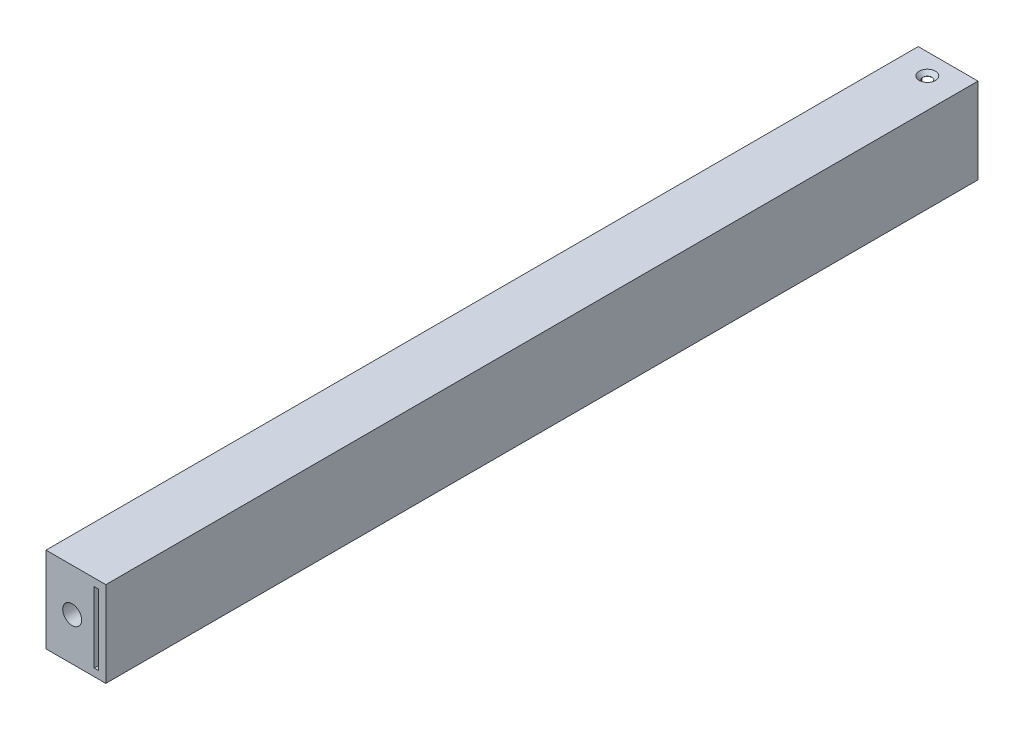
ISO-10303-21;
HEADER;
FILE_DESCRIPTION(('STEP AP214'),'2;1');
FILE_NAME('part.step','',(''),(''),'','','');
FILE_SCHEMA(('AUTOMOTIVE_DESIGN { 1 0 10303 214 1 1 1 1 }'));
ENDSEC;
DATA;
#1=APPLICATION_CONTEXT('core data for automotive mechanical design processes');
#2=APPLICATION_PROTOCOL_DEFINITION('international standard','automotive_design',2000,#1);
#3=PRODUCT_CONTEXT('',#1,'mechanical');
#4=PRODUCT('Part','Part','',(#3));
#5=PRODUCT_RELATED_PRODUCT_CATEGORY('part','',(#4));
#6=PRODUCT_DEFINITION_FORMATION('','',#4);
#7=PRODUCT_DEFINITION_CONTEXT('part definition',#1,'design');
#8=PRODUCT_DEFINITION('design','',#6,#7);
#9=PRODUCT_DEFINITION_SHAPE('','',#8);
#10=(LENGTH_UNIT() NAMED_UNIT(*) SI_UNIT(.MILLI.,.METRE.));
#11=(NAMED_UNIT(*) PLANE_ANGLE_UNIT() SI_UNIT($,.RADIAN.));
#12=(NAMED_UNIT(*) SI_UNIT($,.STERADIAN.) SOLID_ANGLE_UNIT());
#13=UNCERTAINTY_MEASURE_WITH_UNIT(LENGTH_MEASURE(1.E-05),#10,'distance_accuracy_value','');
#14=(GEOMETRIC_REPRESENTATION_CONTEXT(3) GLOBAL_UNCERTAINTY_ASSIGNED_CONTEXT((#13)) GLOBAL_UNIT_ASSIGNED_CONTEXT((#10,
#11,#12)) REPRESENTATION_CONTEXT('',''));
#15=CARTESIAN_POINT('',(0.,0.,0.));
#16=DIRECTION('',(0.,0.,1.));
#17=DIRECTION('',(1.,0.,0.));
#18=AXIS2_PLACEMENT_3D('',#15,#16,#17);
#19=CARTESIAN_POINT('',(0.,0.,-3.2));
#20=DIRECTION('',(0.,0.,1.));
#21=DIRECTION('',(1.,0.,0.));
#22=AXIS2_PLACEMENT_3D('',#19,#20,#21);
#23=PLANE('',#22);
#24=CARTESIAN_POINT('',(0.,0.,-3.20000000000001));
#25=DIRECTION('',(0.,0.,1.));
#26=DIRECTION('',(1.,0.,0.));
#27=AXIS2_PLACEMENT_3D('',#24,#25,#26);
#28=CIRCLE('',#27,2.275);
#29=CARTESIAN_POINT('',(2.275,0.,-3.20000000000001));
#30=VERTEX_POINT('',#29);
#31=EDGE_CURVE('E412',#30,#30,#28,.F.);
#32=ORIENTED_EDGE('',*,*,#31,.F.);
#33=EDGE_LOOP('',(#32));
#34=FACE_BOUND('',#33,.T.);
#35=DIRECTION('',(1.,0.,0.));
#36=VECTOR('',#35,1.);
#37=CARTESIAN_POINT('',(6.30000000000001,8.49999999999999,-3.2));
#38=LINE('',#37,#36);
#39=CARTESIAN_POINT('',(-0.50000000000002,8.49999999999999,-3.2));
#40=VERTEX_POINT('',#39);
#41=CARTESIAN_POINT('',(0.500000000000007,8.49999999999999,-3.2));
#42=VERTEX_POINT('',#41);
#43=EDGE_CURVE('E286',#40,#42,#38,.T.);
#44=ORIENTED_EDGE('',*,*,#43,.T.);
#45=DIRECTION('',(-0.707106781186552,0.707106781186543,0.));
#46=VECTOR('',#45,1.);
#47=CARTESIAN_POINT('',(0.500000000000005,8.49999999999999,-3.2));
#48=LINE('',#47,#46);
#49=CARTESIAN_POINT('',(4.50000000000001,4.50000000000004,-3.2));
#50=VERTEX_POINT('',#49);
#51=EDGE_CURVE('E372',#42,#50,#48,.F.);
#52=ORIENTED_EDGE('',*,*,#51,.T.);
#53=DIRECTION('',(0.,1.,0.));
#54=VECTOR('',#53,1.);
#55=CARTESIAN_POINT('',(4.50000000000001,8.49999999999999,-3.2));
#56=LINE('',#55,#54);
#57=CARTESIAN_POINT('',(4.50000000000001,-4.49999999999996,-3.2));
#58=VERTEX_POINT('',#57);
#59=EDGE_CURVE('E229',#58,#50,#56,.T.);
#60=ORIENTED_EDGE('',*,*,#59,.F.);
#61=DIRECTION('',(0.707106781186545,0.70710678118655,0.));
#62=VECTOR('',#61,1.);
#63=CARTESIAN_POINT('',(4.50000000000001,-4.49999999999996,-3.20000000000001));
#64=LINE('',#63,#62);
#65=CARTESIAN_POINT('',(0.500000000000004,-8.5,-3.2));
#66=VERTEX_POINT('',#65);
#67=EDGE_CURVE('E363',#58,#66,#64,.F.);
#68=ORIENTED_EDGE('',*,*,#67,.T.);
#69=DIRECTION('',(-1.,0.,0.));
#70=VECTOR('',#69,1.);
#71=CARTESIAN_POINT('',(-4.5,-8.5,-3.2));
#72=LINE('',#71,#70);
#73=CARTESIAN_POINT('',(-0.499999999999941,-8.5,-3.2));
#74=VERTEX_POINT('',#73);
#75=EDGE_CURVE('E304',#66,#74,#72,.T.);
#76=ORIENTED_EDGE('',*,*,#75,.T.);
#77=DIRECTION('',(-0.707106781186552,0.707106781186543,0.));
#78=VECTOR('',#77,1.);
#79=CARTESIAN_POINT('',(-0.499999999999941,-8.49999999999999,-3.2));
#80=LINE('',#79,#78);
#81=CARTESIAN_POINT('',(-4.5,-4.49999999999999,-3.2));
#82=VERTEX_POINT('',#81);
#83=EDGE_CURVE('E366',#74,#82,#80,.T.);
#84=ORIENTED_EDGE('',*,*,#83,.T.);
#85=DIRECTION('',(0.,1.,0.));
#86=VECTOR('',#85,1.);
#87=CARTESIAN_POINT('',(-4.5,8.49999999999999,-3.2));
#88=LINE('',#87,#86);
#89=CARTESIAN_POINT('',(-4.5,4.49999999999999,-3.2));
#90=VERTEX_POINT('',#89);
#91=EDGE_CURVE('E213',#82,#90,#88,.T.);
#92=ORIENTED_EDGE('',*,*,#91,.T.);
#93=DIRECTION('',(0.707106781186545,0.70710678118655,0.));
#94=VECTOR('',#93,1.);
#95=CARTESIAN_POINT('',(-4.5,4.49999999999999,-3.20000000000001));
#96=LINE('',#95,#94);
#97=EDGE_CURVE('E369',#90,#40,#96,.T.);
#98=ORIENTED_EDGE('',*,*,#97,.T.);
#99=EDGE_LOOP('',(#44,#52,#60,#68,#76,#84,#92,#98));
#100=FACE_BOUND('',#99,.T.);
#101=ADVANCED_FACE('F49',(#34,#100),#23,.F.);
#102=CARTESIAN_POINT('',(5.30000000000001,-8.49999999999999,-3.2));
#103=DIRECTION('',(0.,-1.,0.));
#104=DIRECTION('',(0.,0.,-1.));
#105=AXIS2_PLACEMENT_3D('',#102,#103,#104);
#106=PLANE('',#105);
#107=DIRECTION('',(-1.,0.,0.));
#108=VECTOR('',#107,1.);
#109=CARTESIAN_POINT('',(-4.5,-8.5,-200.));
#110=LINE('',#109,#108);
#111=CARTESIAN_POINT('',(6.30000000000001,-8.49999999999999,-200.));
#112=VERTEX_POINT('',#111);
#113=CARTESIAN_POINT('',(5.30000000000001,-8.49999999999999,-200.));
#114=VERTEX_POINT('',#113);
#115=EDGE_CURVE('E293',#112,#114,#110,.T.);
#116=ORIENTED_EDGE('',*,*,#115,.T.);
#117=DIRECTION('',(0.,0.,1.));
#118=VECTOR('',#117,1.);
#119=CARTESIAN_POINT('',(5.30000000000001,-8.49999999999999,-3.2));
#120=LINE('',#119,#118);
#121=CARTESIAN_POINT('',(5.30000000000001,-8.49999999999999,0.));
#122=VERTEX_POINT('',#121);
#123=EDGE_CURVE('E199',#114,#122,#120,.T.);
#124=ORIENTED_EDGE('',*,*,#123,.T.);
#125=DIRECTION('',(1.,0.,0.));
#126=VECTOR('',#125,1.);
#127=CARTESIAN_POINT('',(5.30000000000001,-8.49999999999999,0.));
#128=LINE('',#127,#126);
#129=CARTESIAN_POINT('',(6.30000000000001,-8.49999999999999,0.));
#130=VERTEX_POINT('',#129);
#131=EDGE_CURVE('E300',#122,#130,#128,.T.);
#132=ORIENTED_EDGE('',*,*,#131,.T.);
#133=DIRECTION('',(0.,0.,1.));
#134=VECTOR('',#133,1.);
#135=CARTESIAN_POINT('',(6.30000000000001,-8.49999999999999,-3.2));
#136=LINE('',#135,#134);
#137=EDGE_CURVE('E323',#112,#130,#136,.T.);
#138=ORIENTED_EDGE('',*,*,#137,.F.);
#139=EDGE_LOOP('',(#116,#124,#132,#138));
#140=FACE_BOUND('',#139,.T.);
#141=ADVANCED_FACE('F483',(#140),#106,.F.);
#142=CARTESIAN_POINT('',(0.500000000000004,-8.5,-200.));
#143=VERTEX_POINT('',#142);
#144=CARTESIAN_POINT('',(-0.499999999999941,-8.5,-200.));
#145=VERTEX_POINT('',#144);
#146=EDGE_CURVE('E292',#143,#145,#110,.T.);
#147=ORIENTED_EDGE('',*,*,#146,.T.);
#148=DIRECTION('',(0.,0.,1.));
#149=VECTOR('',#148,1.);
#150=CARTESIAN_POINT('',(-0.499999999999941,-8.49999999999999,-3.2));
#151=LINE('',#150,#149);
#152=EDGE_CURVE('E391',#145,#74,#151,.T.);
#153=ORIENTED_EDGE('',*,*,#152,.T.);
#154=ORIENTED_EDGE('',*,*,#75,.F.);
#155=DIRECTION('',(0.,0.,-1.));
#156=VECTOR('',#155,1.);
#157=CARTESIAN_POINT('',(0.500000000000003,-8.49999999999999,-200.));
#158=LINE('',#157,#156);
#159=EDGE_CURVE('E72',#66,#143,#158,.T.);
#160=ORIENTED_EDGE('',*,*,#159,.T.);
#161=EDGE_LOOP('',(#147,#153,#154,#160));
#162=FACE_BOUND('',#161,.T.);
#163=ADVANCED_FACE('F489',(#162),#106,.F.);
#164=CARTESIAN_POINT('',(5.30000000000001,8.49999999999999,-3.2));
#165=DIRECTION('',(0.,1.,0.));
#166=DIRECTION('',(0.,0.,1.));
#167=AXIS2_PLACEMENT_3D('',#164,#165,#166);
#168=PLANE('',#167);
#169=DIRECTION('',(0.,0.,1.));
#170=VECTOR('',#169,1.);
#171=CARTESIAN_POINT('',(5.30000000000001,8.49999999999999,-3.2));
#172=LINE('',#171,#170);
#173=CARTESIAN_POINT('',(5.30000000000001,8.49999999999999,-200.));
#174=VERTEX_POINT('',#173);
#175=CARTESIAN_POINT('',(5.30000000000001,8.49999999999999,0.));
#176=VERTEX_POINT('',#175);
#177=EDGE_CURVE('E187',#174,#176,#172,.T.);
#178=ORIENTED_EDGE('',*,*,#177,.F.);
#179=DIRECTION('',(1.,0.,0.));
#180=VECTOR('',#179,1.);
#181=CARTESIAN_POINT('',(6.30000000000001,8.49999999999999,-200.));
#182=LINE('',#181,#180);
#183=CARTESIAN_POINT('',(6.30000000000001,8.49999999999999,-200.));
#184=VERTEX_POINT('',#183);
#185=EDGE_CURVE('E190',#174,#184,#182,.T.);
#186=ORIENTED_EDGE('',*,*,#185,.T.);
#187=DIRECTION('',(0.,0.,1.));
#188=VECTOR('',#187,1.);
#189=CARTESIAN_POINT('',(6.30000000000001,8.49999999999999,-3.2));
#190=LINE('',#189,#188);
#191=CARTESIAN_POINT('',(6.30000000000001,8.49999999999999,0.));
#192=VERTEX_POINT('',#191);
#193=EDGE_CURVE('E200',#184,#192,#190,.T.);
#194=ORIENTED_EDGE('',*,*,#193,.T.);
#195=DIRECTION('',(-1.,0.,0.));
#196=VECTOR('',#195,1.);
#197=CARTESIAN_POINT('',(5.30000000000001,8.49999999999999,0.));
#198=LINE('',#197,#196);
#199=EDGE_CURVE('E193',#192,#176,#198,.T.);
#200=ORIENTED_EDGE('',*,*,#199,.T.);
#201=EDGE_LOOP('',(#178,#186,#194,#200));
#202=FACE_BOUND('',#201,.T.);
#203=ADVANCED_FACE('F189',(#202),#168,.F.);
#204=CARTESIAN_POINT('',(-0.50000000000002,8.49999999999999,-200.));
#205=VERTEX_POINT('',#204);
#206=CARTESIAN_POINT('',(0.500000000000007,8.49999999999999,-200.));
#207=VERTEX_POINT('',#206);
#208=EDGE_CURVE('E212',#205,#207,#182,.T.);
#209=ORIENTED_EDGE('',*,*,#208,.T.);
#210=DIRECTION('',(0.,0.,1.));
#211=VECTOR('',#210,1.);
#212=CARTESIAN_POINT('',(0.500000000000005,8.49999999999999,-3.2));
#213=LINE('',#212,#211);
#214=EDGE_CURVE('E359',#207,#42,#213,.T.);
#215=ORIENTED_EDGE('',*,*,#214,.T.);
#216=ORIENTED_EDGE('',*,*,#43,.F.);
#217=DIRECTION('',(0.,0.,-1.));
#218=VECTOR('',#217,1.);
#219=CARTESIAN_POINT('',(-0.500000000000022,8.49999999999999,-3.2));
#220=LINE('',#219,#218);
#221=EDGE_CURVE('E308',#40,#205,#220,.T.);
#222=ORIENTED_EDGE('',*,*,#221,.T.);
#223=EDGE_LOOP('',(#209,#215,#216,#222));
#224=FACE_BOUND('',#223,.T.);
#225=ADVANCED_FACE('F698',(#224),#168,.F.);
#226=CARTESIAN_POINT('',(0.,0.,-200.));
#227=DIRECTION('',(0.,0.,-1.));
#228=DIRECTION('',(-1.,0.,0.));
#229=AXIS2_PLACEMENT_3D('',#226,#227,#228);
#230=PLANE('',#229);
#231=ORIENTED_EDGE('',*,*,#146,.F.);
#232=DIRECTION('',(-0.707106781186545,-0.70710678118655,0.));
#233=VECTOR('',#232,1.);
#234=CARTESIAN_POINT('',(4.50000000000001,-4.49999999999996,-200.));
#235=LINE('',#234,#233);
#236=CARTESIAN_POINT('',(4.50000000000001,-4.49999999999996,-200.));
#237=VERTEX_POINT('',#236);
#238=EDGE_CURVE('E12',#143,#237,#235,.F.);
#239=ORIENTED_EDGE('',*,*,#238,.T.);
#240=DIRECTION('',(0.,1.,0.));
#241=VECTOR('',#240,1.);
#242=CARTESIAN_POINT('',(4.50000000000001,8.49999999999999,-200.));
#243=LINE('',#242,#241);
#244=CARTESIAN_POINT('',(4.50000000000001,4.50000000000004,-200.));
#245=VERTEX_POINT('',#244);
#246=EDGE_CURVE('E219',#237,#245,#243,.T.);
#247=ORIENTED_EDGE('',*,*,#246,.T.);
#248=DIRECTION('',(0.707106781186552,-0.707106781186543,0.));
#249=VECTOR('',#248,1.);
#250=CARTESIAN_POINT('',(0.500000000000005,8.49999999999999,-200.));
#251=LINE('',#250,#249);
#252=EDGE_CURVE('E395',#245,#207,#251,.F.);
#253=ORIENTED_EDGE('',*,*,#252,.T.);
#254=ORIENTED_EDGE('',*,*,#208,.F.);
#255=DIRECTION('',(-0.707106781186545,-0.70710678118655,0.));
#256=VECTOR('',#255,1.);
#257=CARTESIAN_POINT('',(-4.5,4.49999999999999,-200.));
#258=LINE('',#257,#256);
#259=CARTESIAN_POINT('',(-4.5,4.49999999999999,-200.));
#260=VERTEX_POINT('',#259);
#261=EDGE_CURVE('E398',#205,#260,#258,.T.);
#262=ORIENTED_EDGE('',*,*,#261,.T.);
#263=DIRECTION('',(0.,1.,0.));
#264=VECTOR('',#263,1.);
#265=CARTESIAN_POINT('',(-4.5,8.49999999999999,-200.));
#266=LINE('',#265,#264);
#267=CARTESIAN_POINT('',(-4.5,-4.49999999999999,-200.));
#268=VERTEX_POINT('',#267);
#269=EDGE_CURVE('E296',#268,#260,#266,.T.);
#270=ORIENTED_EDGE('',*,*,#269,.F.);
#271=DIRECTION('',(0.707106781186552,-0.707106781186543,0.));
#272=VECTOR('',#271,1.);
#273=CARTESIAN_POINT('',(-0.499999999999941,-8.49999999999999,-200.));
#274=LINE('',#273,#272);
#275=EDGE_CURVE('E59',#268,#145,#274,.T.);
#276=ORIENTED_EDGE('',*,*,#275,.T.);
#277=EDGE_LOOP('',(#231,#239,#247,#253,#254,#262,#270,#276));
#278=FACE_BOUND('',#277,.T.);
#279=DIRECTION('',(0.,-1.,0.));
#280=VECTOR('',#279,1.);
#281=CARTESIAN_POINT('',(6.30000000000001,-8.49999999999999,-200.));
#282=LINE('',#281,#280);
#283=EDGE_CURVE('E210',#184,#112,#282,.T.);
#284=ORIENTED_EDGE('',*,*,#283,.F.);
#285=ORIENTED_EDGE('',*,*,#185,.F.);
#286=DIRECTION('',(0.,-1.,0.));
#287=VECTOR('',#286,1.);
#288=CARTESIAN_POINT('',(5.30000000000001,-8.49999999999999,-200.));
#289=LINE('',#288,#287);
#290=EDGE_CURVE('E208',#174,#114,#289,.T.);
#291=ORIENTED_EDGE('',*,*,#290,.T.);
#292=ORIENTED_EDGE('',*,*,#115,.F.);
#293=EDGE_LOOP('',(#284,#285,#291,#292));
#294=FACE_BOUND('',#293,.T.);
#295=DIRECTION('',(1.,0.,0.));
#296=VECTOR('',#295,1.);
#297=CARTESIAN_POINT('',(7.21000000000001,9.40999999999999,-200.));
#298=LINE('',#297,#296);
#299=CARTESIAN_POINT('',(-5.41,9.40999999999999,-200.));
#300=VERTEX_POINT('',#299);
#301=CARTESIAN_POINT('',(7.21000000000001,9.40999999999999,-200.));
#302=VERTEX_POINT('',#301);
#303=EDGE_CURVE('E238',#300,#302,#298,.T.);
#304=ORIENTED_EDGE('',*,*,#303,.T.);
#305=DIRECTION('',(0.,-1.,0.));
#306=VECTOR('',#305,1.);
#307=CARTESIAN_POINT('',(7.21000000000001,-9.41000000000001,-200.));
#308=LINE('',#307,#306);
#309=CARTESIAN_POINT('',(7.21000000000001,-9.41000000000001,-200.));
#310=VERTEX_POINT('',#309);
#311=EDGE_CURVE('E218',#302,#310,#308,.T.);
#312=ORIENTED_EDGE('',*,*,#311,.T.);
#313=DIRECTION('',(-1.,0.,0.));
#314=VECTOR('',#313,1.);
#315=CARTESIAN_POINT('',(-5.41,-9.41000000000001,-200.));
#316=LINE('',#315,#314);
#317=CARTESIAN_POINT('',(-5.41,-9.41000000000001,-200.));
#318=VERTEX_POINT('',#317);
#319=EDGE_CURVE('E225',#310,#318,#316,.T.);
#320=ORIENTED_EDGE('',*,*,#319,.T.);
#321=DIRECTION('',(0.,1.,0.));
#322=VECTOR('',#321,1.);
#323=CARTESIAN_POINT('',(-5.41,9.40999999999999,-200.));
#324=LINE('',#323,#322);
#325=EDGE_CURVE('E252',#318,#300,#324,.T.);
#326=ORIENTED_EDGE('',*,*,#325,.T.);
#327=EDGE_LOOP('',(#304,#312,#320,#326));
#328=FACE_BOUND('',#327,.T.);
#329=ADVANCED_FACE('F205',(#278,#294,#328),#230,.T.);
#330=CARTESIAN_POINT('',(8.1,10.3,-3.2));
#331=DIRECTION('',(0.,1.,0.));
#332=DIRECTION('',(-1.,0.,0.));
#333=AXIS2_PLACEMENT_3D('',#330,#331,#332);
#334=PLANE('',#333);
#335=CARTESIAN_POINT('',(0.900000000000011,10.3,-205.));
#336=DIRECTION('',(0.,1.,0.));
#337=DIRECTION('',(0.,0.,1.));
#338=AXIS2_PLACEMENT_3D('',#335,#336,#337);
#339=CIRCLE('',#338,1.95);
#340=CARTESIAN_POINT('',(0.900000000000011,10.3,-203.05));
#341=VERTEX_POINT('',#340);
#342=EDGE_CURVE('E418',#341,#341,#339,.T.);
#343=ORIENTED_EDGE('',*,*,#342,.F.);
#344=EDGE_LOOP('',(#343));
#345=FACE_BOUND('',#344,.T.);
#346=DIRECTION('',(-1.,0.,0.));
#347=VECTOR('',#346,1.);
#348=CARTESIAN_POINT('',(8.1,10.3,0.));
#349=LINE('',#348,#347);
#350=CARTESIAN_POINT('',(8.1,10.3,0.));
#351=VERTEX_POINT('',#350);
#352=CARTESIAN_POINT('',(-6.3,10.3,0.));
#353=VERTEX_POINT('',#352);
#354=EDGE_CURVE('E325',#351,#353,#349,.T.);
#355=ORIENTED_EDGE('',*,*,#354,.F.);
#356=DIRECTION('',(0.,0.,1.));
#357=VECTOR('',#356,1.);
#358=CARTESIAN_POINT('',(8.1,10.3,-3.2));
#359=LINE('',#358,#357);
#360=CARTESIAN_POINT('',(8.1,10.3,-210.));
#361=VERTEX_POINT('',#360);
#362=EDGE_CURVE('E309',#361,#351,#359,.T.);
#363=ORIENTED_EDGE('',*,*,#362,.F.);
#364=DIRECTION('',(1.,0.,0.));
#365=VECTOR('',#364,1.);
#366=CARTESIAN_POINT('',(-6.3,10.3,-210.));
#367=LINE('',#366,#365);
#368=CARTESIAN_POINT('',(-6.3,10.3,-210.));
#369=VERTEX_POINT('',#368);
#370=EDGE_CURVE('E279',#369,#361,#367,.T.);
#371=ORIENTED_EDGE('',*,*,#370,.F.);
#372=DIRECTION('',(0.,0.,1.));
#373=VECTOR('',#372,1.);
#374=CARTESIAN_POINT('',(-6.3,10.3,-3.2));
#375=LINE('',#374,#373);
#376=EDGE_CURVE('E347',#369,#353,#375,.T.);
#377=ORIENTED_EDGE('',*,*,#376,.T.);
#378=EDGE_LOOP('',(#355,#363,#371,#377));
#379=FACE_BOUND('',#378,.T.);
#380=ADVANCED_FACE('F449',(#345,#379),#334,.T.);
#381=CARTESIAN_POINT('',(8.1,-10.3,-3.2));
#382=DIRECTION('',(1.,0.,0.));
#383=DIRECTION('',(0.,1.,0.));
#384=AXIS2_PLACEMENT_3D('',#381,#382,#383);
#385=PLANE('',#384);
#386=DIRECTION('',(0.,1.,0.));
#387=VECTOR('',#386,1.);
#388=CARTESIAN_POINT('',(8.1,-10.3,0.));
#389=LINE('',#388,#387);
#390=CARTESIAN_POINT('',(8.1,-10.3,0.));
#391=VERTEX_POINT('',#390);
#392=EDGE_CURVE('E343',#391,#351,#389,.T.);
#393=ORIENTED_EDGE('',*,*,#392,.F.);
#394=DIRECTION('',(0.,0.,1.));
#395=VECTOR('',#394,1.);
#396=CARTESIAN_POINT('',(8.1,-10.3,-3.2));
#397=LINE('',#396,#395);
#398=CARTESIAN_POINT('',(8.1,-10.3,-210.));
#399=VERTEX_POINT('',#398);
#400=EDGE_CURVE('E350',#399,#391,#397,.T.);
#401=ORIENTED_EDGE('',*,*,#400,.F.);
#402=DIRECTION('',(0.,-1.,0.));
#403=VECTOR('',#402,1.);
#404=CARTESIAN_POINT('',(8.1,10.3,-210.));
#405=LINE('',#404,#403);
#406=EDGE_CURVE('E283',#361,#399,#405,.T.);
#407=ORIENTED_EDGE('',*,*,#406,.F.);
#408=ORIENTED_EDGE('',*,*,#362,.T.);
#409=EDGE_LOOP('',(#393,#401,#407,#408));
#410=FACE_BOUND('',#409,.T.);
#411=ADVANCED_FACE('F452',(#410),#385,.T.);
#412=CARTESIAN_POINT('',(-6.3,-10.3,-3.2));
#413=DIRECTION('',(0.,-1.,0.));
#414=DIRECTION('',(1.,0.,0.));
#415=AXIS2_PLACEMENT_3D('',#412,#413,#414);
#416=PLANE('',#415);
#417=CARTESIAN_POINT('',(0.900000000000003,-10.3,-205.));
#418=DIRECTION('',(0.,-1.,0.));
#419=DIRECTION('',(0.,0.,-1.));
#420=AXIS2_PLACEMENT_3D('',#417,#418,#419);
#421=CIRCLE('',#420,1.95);
#422=CARTESIAN_POINT('',(0.900000000000003,-10.3,-206.95));
#423=VERTEX_POINT('',#422);
#424=EDGE_CURVE('E406',#423,#423,#421,.T.);
#425=ORIENTED_EDGE('',*,*,#424,.F.);
#426=EDGE_LOOP('',(#425));
#427=FACE_BOUND('',#426,.T.);
#428=DIRECTION('',(1.,0.,0.));
#429=VECTOR('',#428,1.);
#430=CARTESIAN_POINT('',(-6.3,-10.3,0.));
#431=LINE('',#430,#429);
#432=CARTESIAN_POINT('',(-6.3,-10.3,0.));
#433=VERTEX_POINT('',#432);
#434=EDGE_CURVE('E339',#433,#391,#431,.T.);
#435=ORIENTED_EDGE('',*,*,#434,.F.);
#436=DIRECTION('',(0.,0.,1.));
#437=VECTOR('',#436,1.);
#438=CARTESIAN_POINT('',(-6.3,-10.3,-3.2));
#439=LINE('',#438,#437);
#440=CARTESIAN_POINT('',(-6.3,-10.3,-210.));
#441=VERTEX_POINT('',#440);
#442=EDGE_CURVE('E353',#441,#433,#439,.T.);
#443=ORIENTED_EDGE('',*,*,#442,.F.);
#444=DIRECTION('',(-1.,0.,0.));
#445=VECTOR('',#444,1.);
#446=CARTESIAN_POINT('',(8.1,-10.3,-210.));
#447=LINE('',#446,#445);
#448=EDGE_CURVE('E271',#399,#441,#447,.T.);
#449=ORIENTED_EDGE('',*,*,#448,.F.);
#450=ORIENTED_EDGE('',*,*,#400,.T.);
#451=EDGE_LOOP('',(#435,#443,#449,#450));
#452=FACE_BOUND('',#451,.T.);
#453=ADVANCED_FACE('F468',(#427,#452),#416,.T.);
#454=CARTESIAN_POINT('',(-6.3,10.3,-3.2));
#455=DIRECTION('',(-1.,0.,0.));
#456=DIRECTION('',(0.,-1.,0.));
#457=AXIS2_PLACEMENT_3D('',#454,#455,#456);
#458=PLANE('',#457);
#459=DIRECTION('',(0.,-1.,0.));
#460=VECTOR('',#459,1.);
#461=CARTESIAN_POINT('',(-6.3,10.3,0.));
#462=LINE('',#461,#460);
#463=EDGE_CURVE('E335',#353,#433,#462,.T.);
#464=ORIENTED_EDGE('',*,*,#463,.F.);
#465=ORIENTED_EDGE('',*,*,#376,.F.);
#466=DIRECTION('',(0.,1.,0.));
#467=VECTOR('',#466,1.);
#468=CARTESIAN_POINT('',(-6.3,-10.3,-210.));
#469=LINE('',#468,#467);
#470=EDGE_CURVE('E275',#441,#369,#469,.T.);
#471=ORIENTED_EDGE('',*,*,#470,.F.);
#472=ORIENTED_EDGE('',*,*,#442,.T.);
#473=EDGE_LOOP('',(#464,#465,#471,#472));
#474=FACE_BOUND('',#473,.T.);
#475=ADVANCED_FACE('F471',(#474),#458,.T.);
#476=CARTESIAN_POINT('',(0.,0.,0.));
#477=DIRECTION('',(0.,0.,1.));
#478=DIRECTION('',(1.,0.,0.));
#479=AXIS2_PLACEMENT_3D('',#476,#477,#478);
#480=PLANE('',#479);
#481=CARTESIAN_POINT('',(0.,0.,0.));
#482=DIRECTION('',(0.,0.,1.));
#483=DIRECTION('',(1.,0.,0.));
#484=AXIS2_PLACEMENT_3D('',#481,#482,#483);
#485=CIRCLE('',#484,2.275);
#486=CARTESIAN_POINT('',(2.275,0.,0.));
#487=VERTEX_POINT('',#486);
#488=EDGE_CURVE('E409',#487,#487,#485,.T.);
#489=ORIENTED_EDGE('',*,*,#488,.F.);
#490=EDGE_LOOP('',(#489));
#491=FACE_BOUND('',#490,.T.);
#492=ORIENTED_EDGE('',*,*,#131,.F.);
#493=DIRECTION('',(0.,-1.,0.));
#494=VECTOR('',#493,1.);
#495=CARTESIAN_POINT('',(5.30000000000001,-8.49999999999999,0.));
#496=LINE('',#495,#494);
#497=EDGE_CURVE('E320',#176,#122,#496,.T.);
#498=ORIENTED_EDGE('',*,*,#497,.F.);
#499=ORIENTED_EDGE('',*,*,#199,.F.);
#500=DIRECTION('',(0.,1.,0.));
#501=VECTOR('',#500,1.);
#502=CARTESIAN_POINT('',(6.30000000000001,-8.49999999999999,0.));
#503=LINE('',#502,#501);
#504=EDGE_CURVE('E314',#130,#192,#503,.T.);
#505=ORIENTED_EDGE('',*,*,#504,.F.);
#506=EDGE_LOOP('',(#492,#498,#499,#505));
#507=FACE_BOUND('',#506,.T.);
#508=ORIENTED_EDGE('',*,*,#354,.T.);
#509=ORIENTED_EDGE('',*,*,#463,.T.);
#510=ORIENTED_EDGE('',*,*,#434,.T.);
#511=ORIENTED_EDGE('',*,*,#392,.T.);
#512=EDGE_LOOP('',(#508,#509,#510,#511));
#513=FACE_BOUND('',#512,.T.);
#514=ADVANCED_FACE('F459',(#491,#507,#513),#480,.T.);
#515=CARTESIAN_POINT('',(5.30000000000001,-8.49999999999999,-3.2));
#516=DIRECTION('',(-1.,0.,0.));
#517=DIRECTION('',(0.,-1.,0.));
#518=AXIS2_PLACEMENT_3D('',#515,#516,#517);
#519=PLANE('',#518);
#520=ORIENTED_EDGE('',*,*,#497,.T.);
#521=ORIENTED_EDGE('',*,*,#123,.F.);
#522=ORIENTED_EDGE('',*,*,#290,.F.);
#523=ORIENTED_EDGE('',*,*,#177,.T.);
#524=EDGE_LOOP('',(#520,#521,#522,#523));
#525=FACE_BOUND('',#524,.T.);
#526=ADVANCED_FACE('F215',(#525),#519,.F.);
#527=CARTESIAN_POINT('',(6.30000000000001,-8.49999999999999,-3.2));
#528=DIRECTION('',(1.,0.,0.));
#529=DIRECTION('',(0.,1.,0.));
#530=AXIS2_PLACEMENT_3D('',#527,#528,#529);
#531=PLANE('',#530);
#532=ORIENTED_EDGE('',*,*,#504,.T.);
#533=ORIENTED_EDGE('',*,*,#193,.F.);
#534=ORIENTED_EDGE('',*,*,#283,.T.);
#535=ORIENTED_EDGE('',*,*,#137,.T.);
#536=EDGE_LOOP('',(#532,#533,#534,#535));
#537=FACE_BOUND('',#536,.T.);
#538=ADVANCED_FACE('F523',(#537),#531,.F.);
#539=CARTESIAN_POINT('',(-4.5,8.49999999999999,-200.));
#540=DIRECTION('',(1.,0.,0.));
#541=DIRECTION('',(0.,1.,0.));
#542=AXIS2_PLACEMENT_3D('',#539,#540,#541);
#543=PLANE('',#542);
#544=ORIENTED_EDGE('',*,*,#269,.T.);
#545=DIRECTION('',(0.,0.,1.));
#546=VECTOR('',#545,1.);
#547=CARTESIAN_POINT('',(-4.5,4.49999999999999,-200.));
#548=LINE('',#547,#546);
#549=EDGE_CURVE('E385',#260,#90,#548,.T.);
#550=ORIENTED_EDGE('',*,*,#549,.T.);
#551=ORIENTED_EDGE('',*,*,#91,.F.);
#552=DIRECTION('',(0.,0.,-1.));
#553=VECTOR('',#552,1.);
#554=CARTESIAN_POINT('',(-4.5,-4.49999999999999,-200.));
#555=LINE('',#554,#553);
#556=EDGE_CURVE('E382',#82,#268,#555,.T.);
#557=ORIENTED_EDGE('',*,*,#556,.T.);
#558=EDGE_LOOP('',(#544,#550,#551,#557));
#559=FACE_BOUND('',#558,.T.);
#560=ADVANCED_FACE('F532',(#559),#543,.T.);
#561=CARTESIAN_POINT('',(0.,0.,-210.));
#562=DIRECTION('',(0.,0.,-1.));
#563=DIRECTION('',(-1.,0.,0.));
#564=AXIS2_PLACEMENT_3D('',#561,#562,#563);
#565=PLANE('',#564);
#566=ORIENTED_EDGE('',*,*,#448,.T.);
#567=ORIENTED_EDGE('',*,*,#470,.T.);
#568=ORIENTED_EDGE('',*,*,#370,.T.);
#569=ORIENTED_EDGE('',*,*,#406,.T.);
#570=EDGE_LOOP('',(#566,#567,#568,#569));
#571=FACE_BOUND('',#570,.T.);
#572=DIRECTION('',(-1.,0.,0.));
#573=VECTOR('',#572,1.);
#574=CARTESIAN_POINT('',(-5.41,-9.41000000000001,-210.));
#575=LINE('',#574,#573);
#576=CARTESIAN_POINT('',(7.21000000000001,-9.41000000000001,-210.));
#577=VERTEX_POINT('',#576);
#578=CARTESIAN_POINT('',(-5.41,-9.41000000000001,-210.));
#579=VERTEX_POINT('',#578);
#580=EDGE_CURVE('E237',#577,#579,#575,.T.);
#581=ORIENTED_EDGE('',*,*,#580,.F.);
#582=DIRECTION('',(0.,-1.,0.));
#583=VECTOR('',#582,1.);
#584=CARTESIAN_POINT('',(7.21000000000001,-9.41000000000001,-210.));
#585=LINE('',#584,#583);
#586=CARTESIAN_POINT('',(7.21000000000001,9.40999999999999,-210.));
#587=VERTEX_POINT('',#586);
#588=EDGE_CURVE('E234',#587,#577,#585,.T.);
#589=ORIENTED_EDGE('',*,*,#588,.F.);
#590=DIRECTION('',(1.,0.,0.));
#591=VECTOR('',#590,1.);
#592=CARTESIAN_POINT('',(7.21000000000001,9.40999999999999,-210.));
#593=LINE('',#592,#591);
#594=CARTESIAN_POINT('',(-5.41,9.40999999999999,-210.));
#595=VERTEX_POINT('',#594);
#596=EDGE_CURVE('E245',#595,#587,#593,.T.);
#597=ORIENTED_EDGE('',*,*,#596,.F.);
#598=DIRECTION('',(0.,1.,0.));
#599=VECTOR('',#598,1.);
#600=CARTESIAN_POINT('',(-5.41,9.40999999999999,-210.));
#601=LINE('',#600,#599);
#602=EDGE_CURVE('E241',#579,#595,#601,.T.);
#603=ORIENTED_EDGE('',*,*,#602,.F.);
#604=EDGE_LOOP('',(#581,#589,#597,#603));
#605=FACE_BOUND('',#604,.T.);
#606=ADVANCED_FACE('F465',(#571,#605),#565,.T.);
#607=CARTESIAN_POINT('',(7.21000000000001,-9.41000000000001,-210.));
#608=DIRECTION('',(-1.,0.,0.));
#609=DIRECTION('',(0.,0.,1.));
#610=AXIS2_PLACEMENT_3D('',#607,#608,#609);
#611=PLANE('',#610);
#612=ORIENTED_EDGE('',*,*,#311,.F.);
#613=DIRECTION('',(0.,0.,1.));
#614=VECTOR('',#613,1.);
#615=CARTESIAN_POINT('',(7.21000000000001,9.40999999999999,-210.));
#616=LINE('',#615,#614);
#617=EDGE_CURVE('E247',#587,#302,#616,.T.);
#618=ORIENTED_EDGE('',*,*,#617,.F.);
#619=ORIENTED_EDGE('',*,*,#588,.T.);
#620=DIRECTION('',(0.,0.,1.));
#621=VECTOR('',#620,1.);
#622=CARTESIAN_POINT('',(7.21000000000001,-9.41000000000001,-210.));
#623=LINE('',#622,#621);
#624=EDGE_CURVE('E267',#577,#310,#623,.T.);
#625=ORIENTED_EDGE('',*,*,#624,.T.);
#626=EDGE_LOOP('',(#612,#618,#619,#625));
#627=FACE_BOUND('',#626,.T.);
#628=ADVANCED_FACE('F549',(#627),#611,.T.);
#629=CARTESIAN_POINT('',(-5.41,-9.41000000000001,-210.));
#630=DIRECTION('',(0.,1.,0.));
#631=DIRECTION('',(-1.,0.,0.));
#632=AXIS2_PLACEMENT_3D('',#629,#630,#631);
#633=PLANE('',#632);
#634=CARTESIAN_POINT('',(0.900000000000003,-9.41000000000001,-205.));
#635=DIRECTION('',(0.,1.,0.));
#636=DIRECTION('',(-1.,0.,0.));
#637=AXIS2_PLACEMENT_3D('',#634,#635,#636);
#638=CIRCLE('',#637,1.1);
#639=CARTESIAN_POINT('',(-0.199999999999996,-9.41000000000001,-205.));
#640=VERTEX_POINT('',#639);
#641=EDGE_CURVE('E405',#640,#640,#638,.T.);
#642=ORIENTED_EDGE('',*,*,#641,.F.);
#643=EDGE_LOOP('',(#642));
#644=FACE_BOUND('',#643,.T.);
#645=ORIENTED_EDGE('',*,*,#319,.F.);
#646=ORIENTED_EDGE('',*,*,#624,.F.);
#647=ORIENTED_EDGE('',*,*,#580,.T.);
#648=DIRECTION('',(0.,0.,1.));
#649=VECTOR('',#648,1.);
#650=CARTESIAN_POINT('',(-5.41,-9.41000000000001,-210.));
#651=LINE('',#650,#649);
#652=EDGE_CURVE('E264',#579,#318,#651,.T.);
#653=ORIENTED_EDGE('',*,*,#652,.T.);
#654=EDGE_LOOP('',(#645,#646,#647,#653));
#655=FACE_BOUND('',#654,.T.);
#656=ADVANCED_FACE('F557',(#644,#655),#633,.T.);
#657=CARTESIAN_POINT('',(-5.41,9.40999999999999,-210.));
#658=DIRECTION('',(1.,0.,0.));
#659=DIRECTION('',(0.,1.,0.));
#660=AXIS2_PLACEMENT_3D('',#657,#658,#659);
#661=PLANE('',#660);
#662=ORIENTED_EDGE('',*,*,#325,.F.);
#663=ORIENTED_EDGE('',*,*,#652,.F.);
#664=ORIENTED_EDGE('',*,*,#602,.T.);
#665=DIRECTION('',(0.,0.,1.));
#666=VECTOR('',#665,1.);
#667=CARTESIAN_POINT('',(-5.41,9.40999999999999,-210.));
#668=LINE('',#667,#666);
#669=EDGE_CURVE('E261',#595,#300,#668,.T.);
#670=ORIENTED_EDGE('',*,*,#669,.T.);
#671=EDGE_LOOP('',(#662,#663,#664,#670));
#672=FACE_BOUND('',#671,.T.);
#673=ADVANCED_FACE('F566',(#672),#661,.T.);
#674=CARTESIAN_POINT('',(7.21000000000001,9.40999999999999,-210.));
#675=DIRECTION('',(0.,-1.,0.));
#676=DIRECTION('',(0.,0.,-1.));
#677=AXIS2_PLACEMENT_3D('',#674,#675,#676);
#678=PLANE('',#677);
#679=CARTESIAN_POINT('',(0.900000000000011,9.40999999999999,-205.));
#680=DIRECTION('',(0.,-1.,0.));
#681=DIRECTION('',(0.,0.,-1.));
#682=AXIS2_PLACEMENT_3D('',#679,#680,#681);
#683=CIRCLE('',#682,1.1);
#684=CARTESIAN_POINT('',(0.900000000000011,9.40999999999999,-206.1));
#685=VERTEX_POINT('',#684);
#686=EDGE_CURVE('E423',#685,#685,#683,.T.);
#687=ORIENTED_EDGE('',*,*,#686,.F.);
#688=EDGE_LOOP('',(#687));
#689=FACE_BOUND('',#688,.T.);
#690=ORIENTED_EDGE('',*,*,#303,.F.);
#691=ORIENTED_EDGE('',*,*,#669,.F.);
#692=ORIENTED_EDGE('',*,*,#596,.T.);
#693=ORIENTED_EDGE('',*,*,#617,.T.);
#694=EDGE_LOOP('',(#690,#691,#692,#693));
#695=FACE_BOUND('',#694,.T.);
#696=ADVANCED_FACE('F575',(#689,#695),#678,.T.);
#697=CARTESIAN_POINT('',(4.50000000000001,8.49999999999999,-217.018813119604));
#698=DIRECTION('',(1.,0.,0.));
#699=DIRECTION('',(0.,1.,0.));
#700=AXIS2_PLACEMENT_3D('',#697,#698,#699);
#701=PLANE('',#700);
#702=ORIENTED_EDGE('',*,*,#59,.T.);
#703=DIRECTION('',(0.,0.,-1.));
#704=VECTOR('',#703,1.);
#705=CARTESIAN_POINT('',(4.50000000000001,4.50000000000004,-200.));
#706=LINE('',#705,#704);
#707=EDGE_CURVE('E379',#50,#245,#706,.T.);
#708=ORIENTED_EDGE('',*,*,#707,.T.);
#709=ORIENTED_EDGE('',*,*,#246,.F.);
#710=DIRECTION('',(0.,0.,1.));
#711=VECTOR('',#710,1.);
#712=CARTESIAN_POINT('',(4.50000000000001,-4.49999999999996,-3.2));
#713=LINE('',#712,#711);
#714=EDGE_CURVE('E375',#237,#58,#713,.T.);
#715=ORIENTED_EDGE('',*,*,#714,.T.);
#716=EDGE_LOOP('',(#702,#708,#709,#715));
#717=FACE_BOUND('',#716,.T.);
#718=ADVANCED_FACE('F585',(#717),#701,.F.);
#719=CARTESIAN_POINT('',(0.,0.,-210.001));
#720=DIRECTION('',(0.,0.,1.));
#721=DIRECTION('',(1.,0.,0.));
#722=AXIS2_PLACEMENT_3D('',#719,#720,#721);
#723=CYLINDRICAL_SURFACE('',#722,2.275);
#724=ORIENTED_EDGE('',*,*,#488,.T.);
#725=EDGE_LOOP('',(#724));
#726=FACE_BOUND('',#725,.T.);
#727=ORIENTED_EDGE('',*,*,#31,.T.);
#728=EDGE_LOOP('',(#727));
#729=FACE_BOUND('',#728,.T.);
#730=ADVANCED_FACE('F595',(#726,#729),#723,.F.);
#731=CARTESIAN_POINT('',(0.900000000000003,-10.3,-205.));
#732=DIRECTION('',(0.,-1.,0.));
#733=DIRECTION('',(0.,0.,-1.));
#734=AXIS2_PLACEMENT_3D('',#731,#732,#733);
#735=CYLINDRICAL_SURFACE('',#734,1.1);
#736=CARTESIAN_POINT('',(0.900000000000003,-9.45000000000002,-205.));
#737=DIRECTION('',(0.,-1.,0.));
#738=DIRECTION('',(0.,0.,-1.));
#739=AXIS2_PLACEMENT_3D('',#736,#737,#738);
#740=CIRCLE('',#739,1.1);
#741=CARTESIAN_POINT('',(0.900000000000003,-9.45000000000002,-206.1));
#742=VERTEX_POINT('',#741);
#743=EDGE_CURVE('E402',#742,#742,#740,.T.);
#744=ORIENTED_EDGE('',*,*,#743,.T.);
#745=EDGE_LOOP('',(#744));
#746=FACE_BOUND('',#745,.T.);
#747=ORIENTED_EDGE('',*,*,#641,.T.);
#748=EDGE_LOOP('',(#747));
#749=FACE_BOUND('',#748,.T.);
#750=ADVANCED_FACE('F604',(#746,#749),#735,.F.);
#751=CARTESIAN_POINT('',(0.900000000000003,-10.3,-205.));
#752=DIRECTION('',(0.,-1.,0.));
#753=DIRECTION('',(0.,0.,-1.));
#754=AXIS2_PLACEMENT_3D('',#751,#752,#753);
#755=CONICAL_SURFACE('',#754,1.95,0.785398163397449);
#756=ORIENTED_EDGE('',*,*,#743,.F.);
#757=EDGE_LOOP('',(#756));
#758=FACE_BOUND('',#757,.T.);
#759=ORIENTED_EDGE('',*,*,#424,.T.);
#760=EDGE_LOOP('',(#759));
#761=FACE_BOUND('',#760,.T.);
#762=ADVANCED_FACE('F611',(#758,#761),#755,.F.);
#763=CARTESIAN_POINT('',(0.900000000000011,10.3,-205.));
#764=DIRECTION('',(0.,1.,0.));
#765=DIRECTION('',(0.,0.,1.));
#766=AXIS2_PLACEMENT_3D('',#763,#764,#765);
#767=CYLINDRICAL_SURFACE('',#766,1.1);
#768=CARTESIAN_POINT('',(0.900000000000011,9.44999999999999,-205.));
#769=DIRECTION('',(0.,1.,0.));
#770=DIRECTION('',(0.,0.,1.));
#771=AXIS2_PLACEMENT_3D('',#768,#769,#770);
#772=CIRCLE('',#771,1.1);
#773=CARTESIAN_POINT('',(0.900000000000011,9.44999999999999,-203.9));
#774=VERTEX_POINT('',#773);
#775=EDGE_CURVE('E420',#774,#774,#772,.T.);
#776=ORIENTED_EDGE('',*,*,#775,.T.);
#777=EDGE_LOOP('',(#776));
#778=FACE_BOUND('',#777,.T.);
#779=ORIENTED_EDGE('',*,*,#686,.T.);
#780=EDGE_LOOP('',(#779));
#781=FACE_BOUND('',#780,.T.);
#782=ADVANCED_FACE('F439',(#778,#781),#767,.F.);
#783=CARTESIAN_POINT('',(0.900000000000011,10.3,-205.));
#784=DIRECTION('',(0.,1.,0.));
#785=DIRECTION('',(0.,0.,1.));
#786=AXIS2_PLACEMENT_3D('',#783,#784,#785);
#787=CONICAL_SURFACE('',#786,1.95,0.785398163397448);
#788=ORIENTED_EDGE('',*,*,#775,.F.);
#789=EDGE_LOOP('',(#788));
#790=FACE_BOUND('',#789,.T.);
#791=ORIENTED_EDGE('',*,*,#342,.T.);
#792=EDGE_LOOP('',(#791));
#793=FACE_BOUND('',#792,.T.);
#794=ADVANCED_FACE('F442',(#790,#793),#787,.F.);
#795=CARTESIAN_POINT('',(0.500000000000005,8.49999999999999,-3.2));
#796=DIRECTION('',(-0.707106781186543,-0.707106781186552,0.));
#797=DIRECTION('',(0.,0.,-1.));
#798=AXIS2_PLACEMENT_3D('',#795,#796,#797);
#799=PLANE('',#798);
#800=ORIENTED_EDGE('',*,*,#252,.F.);
#801=ORIENTED_EDGE('',*,*,#707,.F.);
#802=ORIENTED_EDGE('',*,*,#51,.F.);
#803=ORIENTED_EDGE('',*,*,#214,.F.);
#804=EDGE_LOOP('',(#800,#801,#802,#803));
#805=FACE_BOUND('',#804,.T.);
#806=ADVANCED_FACE('F445',(#805),#799,.T.);
#807=CARTESIAN_POINT('',(-4.5,4.49999999999999,-200.));
#808=DIRECTION('',(-0.70710678118655,0.707106781186545,0.));
#809=DIRECTION('',(0.,0.,1.));
#810=AXIS2_PLACEMENT_3D('',#807,#808,#809);
#811=PLANE('',#810);
#812=ORIENTED_EDGE('',*,*,#261,.F.);
#813=ORIENTED_EDGE('',*,*,#221,.F.);
#814=ORIENTED_EDGE('',*,*,#97,.F.);
#815=ORIENTED_EDGE('',*,*,#549,.F.);
#816=EDGE_LOOP('',(#812,#813,#814,#815));
#817=FACE_BOUND('',#816,.T.);
#818=ADVANCED_FACE('F639',(#817),#811,.F.);
#819=CARTESIAN_POINT('',(-0.499999999999941,-8.49999999999999,-3.2));
#820=DIRECTION('',(-0.707106781186542,-0.707106781186552,0.));
#821=DIRECTION('',(0.,0.,1.));
#822=AXIS2_PLACEMENT_3D('',#819,#820,#821);
#823=PLANE('',#822);
#824=ORIENTED_EDGE('',*,*,#275,.F.);
#825=ORIENTED_EDGE('',*,*,#556,.F.);
#826=ORIENTED_EDGE('',*,*,#83,.F.);
#827=ORIENTED_EDGE('',*,*,#152,.F.);
#828=EDGE_LOOP('',(#824,#825,#826,#827));
#829=FACE_BOUND('',#828,.T.);
#830=ADVANCED_FACE('F648',(#829),#823,.F.);
#831=CARTESIAN_POINT('',(4.50000000000001,-4.49999999999996,-217.018813119604));
#832=DIRECTION('',(-0.70710678118655,0.707106781186545,0.));
#833=DIRECTION('',(0.,0.,-1.));
#834=AXIS2_PLACEMENT_3D('',#831,#832,#833);
#835=PLANE('',#834);
#836=ORIENTED_EDGE('',*,*,#238,.F.);
#837=ORIENTED_EDGE('',*,*,#159,.F.);
#838=ORIENTED_EDGE('',*,*,#67,.F.);
#839=ORIENTED_EDGE('',*,*,#714,.F.);
#840=EDGE_LOOP('',(#836,#837,#838,#839));
#841=FACE_BOUND('',#840,.T.);
#842=ADVANCED_FACE('F52',(#841),#835,.T.);
#843=CLOSED_SHELL('',(#101,#141,#163,#203,#225,#329,#380,#411,#453,#475,#514,#526,#538,#560,
#606,#628,#656,#673,#696,#718,#730,#750,#762,#782,#794,#806,#818,#830,#842));
#844=MANIFOLD_SOLID_BREP('B2',#843);
#845=ADVANCED_BREP_SHAPE_REPRESENTATION('',(#18,#844),#14);
#846=SHAPE_DEFINITION_REPRESENTATION(#9,#845);
ENDSEC;
END-ISO-10303-21;
